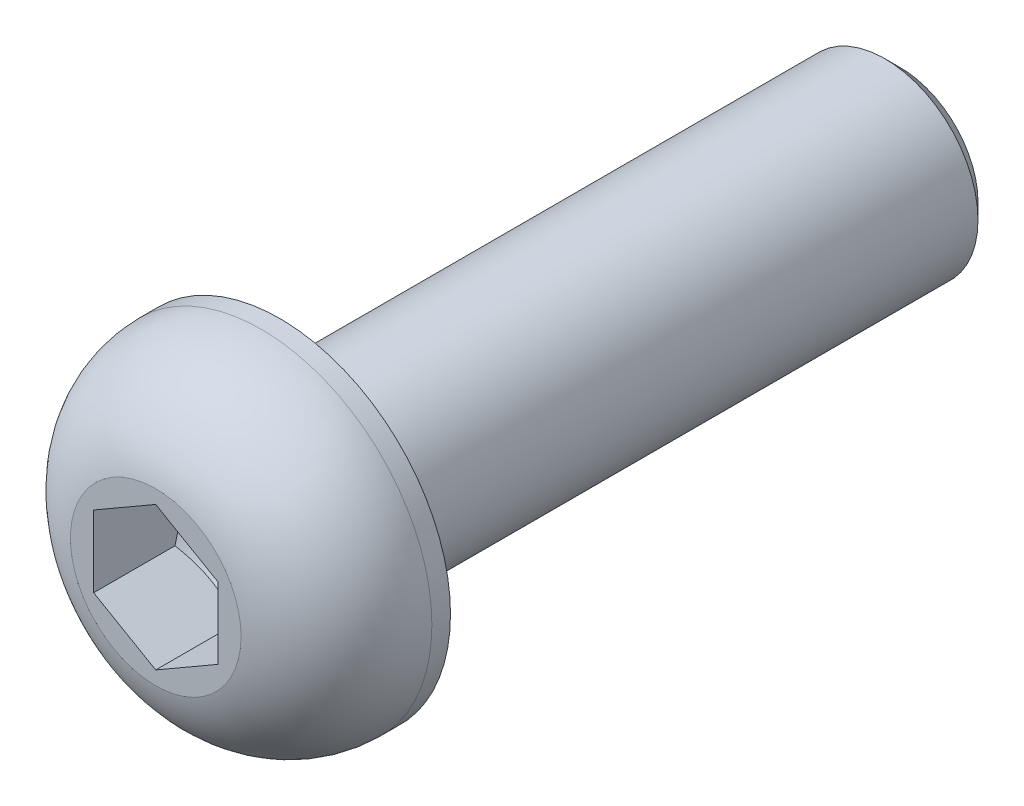
ISO-10303-21;
HEADER;
FILE_DESCRIPTION(('STEP AP214'),'2;1');
FILE_NAME('part.step','',(''),(''),'','','');
FILE_SCHEMA(('AUTOMOTIVE_DESIGN { 1 0 10303 214 1 1 1 1 }'));
ENDSEC;
DATA;
#1=APPLICATION_CONTEXT('core data for automotive mechanical design processes');
#2=APPLICATION_PROTOCOL_DEFINITION('international standard','automotive_design',2000,#1);
#3=PRODUCT_CONTEXT('',#1,'mechanical');
#4=PRODUCT('Part','Part','',(#3));
#5=PRODUCT_RELATED_PRODUCT_CATEGORY('part','',(#4));
#6=PRODUCT_DEFINITION_FORMATION('','',#4);
#7=PRODUCT_DEFINITION_CONTEXT('part definition',#1,'design');
#8=PRODUCT_DEFINITION('design','',#6,#7);
#9=PRODUCT_DEFINITION_SHAPE('','',#8);
#10=(LENGTH_UNIT() NAMED_UNIT(*) SI_UNIT(.MILLI.,.METRE.));
#11=(NAMED_UNIT(*) PLANE_ANGLE_UNIT() SI_UNIT($,.RADIAN.));
#12=(NAMED_UNIT(*) SI_UNIT($,.STERADIAN.) SOLID_ANGLE_UNIT());
#13=UNCERTAINTY_MEASURE_WITH_UNIT(LENGTH_MEASURE(1.E-05),#10,'distance_accuracy_value','');
#14=(GEOMETRIC_REPRESENTATION_CONTEXT(3) GLOBAL_UNCERTAINTY_ASSIGNED_CONTEXT((#13)) GLOBAL_UNIT_ASSIGNED_CONTEXT((#10,
#11,#12)) REPRESENTATION_CONTEXT('',''));
#15=CARTESIAN_POINT('',(0.,0.,0.));
#16=DIRECTION('',(0.,0.,1.));
#17=DIRECTION('',(1.,0.,0.));
#18=AXIS2_PLACEMENT_3D('',#15,#16,#17);
#19=CARTESIAN_POINT('',(0.,1.375,2.));
#20=DIRECTION('',(0.,0.,-1.));
#21=DIRECTION('',(-1.,0.,0.));
#22=AXIS2_PLACEMENT_3D('',#19,#20,#21);
#23=PLANE('',#22);
#24=CARTESIAN_POINT('',(0.,0.,2.));
#25=DIRECTION('',(0.,0.,1.));
#26=DIRECTION('',(1.,0.,0.));
#27=AXIS2_PLACEMENT_3D('',#24,#25,#26);
#28=CIRCLE('',#27,1.375);
#29=CARTESIAN_POINT('',(1.375,0.,2.));
#30=VERTEX_POINT('',#29);
#31=EDGE_CURVE('E133',#30,#30,#28,.T.);
#32=ORIENTED_EDGE('',*,*,#31,.T.);
#33=EDGE_LOOP('',(#32));
#34=FACE_BOUND('',#33,.T.);
#35=DIRECTION('',(-0.866025403784438,-0.5,0.));
#36=VECTOR('',#35,1.);
#37=CARTESIAN_POINT('',(0.,1.15470053837925,2.));
#38=LINE('',#37,#36);
#39=CARTESIAN_POINT('',(0.,1.15470053837925,2.));
#40=VERTEX_POINT('',#39);
#41=CARTESIAN_POINT('',(-1.,0.577350269189624,2.));
#42=VERTEX_POINT('',#41);
#43=EDGE_CURVE('E86',#40,#42,#38,.T.);
#44=ORIENTED_EDGE('',*,*,#43,.F.);
#45=DIRECTION('',(-0.866025403784439,0.5,0.));
#46=VECTOR('',#45,1.);
#47=CARTESIAN_POINT('',(0.999999999999999,0.577350269189626,2.));
#48=LINE('',#47,#46);
#49=CARTESIAN_POINT('',(0.999999999999999,0.577350269189626,2.));
#50=VERTEX_POINT('',#49);
#51=EDGE_CURVE('E46',#50,#40,#48,.T.);
#52=ORIENTED_EDGE('',*,*,#51,.F.);
#53=DIRECTION('',(0.,1.,0.));
#54=VECTOR('',#53,1.);
#55=CARTESIAN_POINT('',(1.,-0.577350269189625,2.));
#56=LINE('',#55,#54);
#57=CARTESIAN_POINT('',(1.,-0.577350269189625,2.));
#58=VERTEX_POINT('',#57);
#59=EDGE_CURVE('E114',#58,#50,#56,.T.);
#60=ORIENTED_EDGE('',*,*,#59,.F.);
#61=DIRECTION('',(0.866025403784438,0.5,0.));
#62=VECTOR('',#61,1.);
#63=CARTESIAN_POINT('',(0.,-1.15470053837925,2.));
#64=LINE('',#63,#62);
#65=CARTESIAN_POINT('',(0.,-1.15470053837925,2.));
#66=VERTEX_POINT('',#65);
#67=EDGE_CURVE('E108',#66,#58,#64,.T.);
#68=ORIENTED_EDGE('',*,*,#67,.F.);
#69=DIRECTION('',(0.866025403784439,-0.5,0.));
#70=VECTOR('',#69,1.);
#71=CARTESIAN_POINT('',(-1.,-0.577350269189625,2.));
#72=LINE('',#71,#70);
#73=CARTESIAN_POINT('',(-1.,-0.577350269189625,2.));
#74=VERTEX_POINT('',#73);
#75=EDGE_CURVE('E106',#74,#66,#72,.T.);
#76=ORIENTED_EDGE('',*,*,#75,.F.);
#77=DIRECTION('',(0.,-1.,0.));
#78=VECTOR('',#77,1.);
#79=CARTESIAN_POINT('',(-1.,0.577350269189624,2.));
#80=LINE('',#79,#78);
#81=EDGE_CURVE('E94',#42,#74,#80,.T.);
#82=ORIENTED_EDGE('',*,*,#81,.F.);
#83=EDGE_LOOP('',(#44,#52,#60,#68,#76,#82));
#84=FACE_BOUND('',#83,.T.);
#85=ADVANCED_FACE('F31',(#34,#84),#23,.F.);
#86=CARTESIAN_POINT('',(0.,0.,-10.));
#87=DIRECTION('',(0.,0.,1.));
#88=DIRECTION('',(1.,0.,0.));
#89=AXIS2_PLACEMENT_3D('',#86,#87,#88);
#90=PLANE('',#89);
#91=CARTESIAN_POINT('',(0.,0.,-10.));
#92=DIRECTION('',(0.,0.,1.));
#93=DIRECTION('',(1.,0.,0.));
#94=AXIS2_PLACEMENT_3D('',#91,#92,#93);
#95=CIRCLE('',#94,1.25);
#96=CARTESIAN_POINT('',(1.25,0.,-10.));
#97=VERTEX_POINT('',#96);
#98=EDGE_CURVE('E219',#97,#97,#95,.F.);
#99=ORIENTED_EDGE('',*,*,#98,.T.);
#100=EDGE_LOOP('',(#99));
#101=FACE_BOUND('',#100,.T.);
#102=ADVANCED_FACE('F197',(#101),#90,.F.);
#103=CARTESIAN_POINT('',(0.,0.,30.8099697885196));
#104=DIRECTION('',(0.,0.,1.));
#105=DIRECTION('',(1.,0.,0.));
#106=AXIS2_PLACEMENT_3D('',#103,#104,#105);
#107=CYLINDRICAL_SURFACE('',#106,1.5);
#108=CARTESIAN_POINT('',(0.,0.,-0.0999999999999994));
#109=DIRECTION('',(0.,0.,1.));
#110=DIRECTION('',(1.,0.,0.));
#111=AXIS2_PLACEMENT_3D('',#108,#109,#110);
#112=CIRCLE('',#111,1.5);
#113=CARTESIAN_POINT('',(1.5,0.,-0.0999999999999994));
#114=VERTEX_POINT('',#113);
#115=EDGE_CURVE('E11',#114,#114,#112,.F.);
#116=ORIENTED_EDGE('',*,*,#115,.T.);
#117=EDGE_LOOP('',(#116));
#118=FACE_BOUND('',#117,.T.);
#119=CARTESIAN_POINT('',(0.,0.,-9.75));
#120=DIRECTION('',(0.,0.,1.));
#121=DIRECTION('',(1.,0.,0.));
#122=AXIS2_PLACEMENT_3D('',#119,#120,#121);
#123=CIRCLE('',#122,1.5);
#124=CARTESIAN_POINT('',(1.5,0.,-9.75));
#125=VERTEX_POINT('',#124);
#126=EDGE_CURVE('E214',#125,#125,#123,.T.);
#127=ORIENTED_EDGE('',*,*,#126,.T.);
#128=EDGE_LOOP('',(#127));
#129=FACE_BOUND('',#128,.T.);
#130=ADVANCED_FACE('F202',(#118,#129),#107,.T.);
#131=CARTESIAN_POINT('',(0.,1.5,0.));
#132=DIRECTION('',(0.,0.,1.));
#133=DIRECTION('',(1.,0.,0.));
#134=AXIS2_PLACEMENT_3D('',#131,#132,#133);
#135=PLANE('',#134);
#136=CARTESIAN_POINT('',(0.,0.,0.));
#137=DIRECTION('',(0.,0.,1.));
#138=DIRECTION('',(1.,0.,0.));
#139=AXIS2_PLACEMENT_3D('',#136,#137,#138);
#140=CIRCLE('',#139,1.6);
#141=CARTESIAN_POINT('',(1.6,0.,0.));
#142=VERTEX_POINT('',#141);
#143=EDGE_CURVE('E39',#142,#142,#140,.T.);
#144=ORIENTED_EDGE('',*,*,#143,.T.);
#145=EDGE_LOOP('',(#144));
#146=FACE_BOUND('',#145,.T.);
#147=CARTESIAN_POINT('',(0.,0.,0.));
#148=DIRECTION('',(0.,0.,1.));
#149=DIRECTION('',(1.,0.,0.));
#150=AXIS2_PLACEMENT_3D('',#147,#148,#149);
#151=CIRCLE('',#150,2.75);
#152=CARTESIAN_POINT('',(2.75,0.,0.));
#153=VERTEX_POINT('',#152);
#154=EDGE_CURVE('E210',#153,#153,#151,.T.);
#155=ORIENTED_EDGE('',*,*,#154,.F.);
#156=EDGE_LOOP('',(#155));
#157=FACE_BOUND('',#156,.T.);
#158=ADVANCED_FACE('F224',(#146,#157),#135,.F.);
#159=CARTESIAN_POINT('',(0.,0.,30.8099697885196));
#160=DIRECTION('',(0.,0.,1.));
#161=DIRECTION('',(1.,0.,0.));
#162=AXIS2_PLACEMENT_3D('',#159,#160,#161);
#163=CYLINDRICAL_SURFACE('',#162,2.75);
#164=CARTESIAN_POINT('',(0.,0.,0.300000000000002));
#165=DIRECTION('',(0.,0.,1.));
#166=DIRECTION('',(1.,0.,0.));
#167=AXIS2_PLACEMENT_3D('',#164,#165,#166);
#168=CIRCLE('',#167,2.75);
#169=CARTESIAN_POINT('',(2.75,0.,0.300000000000002));
#170=VERTEX_POINT('',#169);
#171=EDGE_CURVE('E208',#170,#170,#168,.T.);
#172=ORIENTED_EDGE('',*,*,#171,.F.);
#173=EDGE_LOOP('',(#172));
#174=FACE_BOUND('',#173,.T.);
#175=ORIENTED_EDGE('',*,*,#154,.T.);
#176=EDGE_LOOP('',(#175));
#177=FACE_BOUND('',#176,.T.);
#178=ADVANCED_FACE('F246',(#174,#177),#163,.T.);
#179=CARTESIAN_POINT('',(0.,0.,0.3));
#180=DIRECTION('',(0.,0.,1.));
#181=DIRECTION('',(1.,0.,0.));
#182=AXIS2_PLACEMENT_3D('',#179,#180,#181);
#183=DEGENERATE_TOROIDAL_SURFACE('',#182,1.01159090909091,1.73840909090909,.T.);
#184=ORIENTED_EDGE('',*,*,#31,.F.);
#185=EDGE_LOOP('',(#184));
#186=FACE_BOUND('',#185,.T.);
#187=ORIENTED_EDGE('',*,*,#171,.T.);
#188=EDGE_LOOP('',(#187));
#189=FACE_BOUND('',#188,.T.);
#190=ADVANCED_FACE('F240',(#186,#189),#183,.T.);
#191=CARTESIAN_POINT('',(0.,0.,-9.75));
#192=DIRECTION('',(0.,0.,1.));
#193=DIRECTION('',(1.,0.,0.));
#194=AXIS2_PLACEMENT_3D('',#191,#192,#193);
#195=CONICAL_SURFACE('',#194,1.5,0.78539816339745);
#196=ORIENTED_EDGE('',*,*,#98,.F.);
#197=EDGE_LOOP('',(#196));
#198=FACE_BOUND('',#197,.T.);
#199=ORIENTED_EDGE('',*,*,#126,.F.);
#200=EDGE_LOOP('',(#199));
#201=FACE_BOUND('',#200,.T.);
#202=ADVANCED_FACE('F238',(#198,#201),#195,.T.);
#203=CARTESIAN_POINT('',(0.999999999999999,0.577350269189626,-10.001));
#204=DIRECTION('',(0.5,0.866025403784439,0.));
#205=DIRECTION('',(-0.866025403784439,0.5,0.));
#206=AXIS2_PLACEMENT_3D('',#203,#204,#205);
#207=PLANE('',#206);
#208=CARTESIAN_POINT('',(-0.000199999999999757,1.15481600843309,0.68938307414271));
#209=CARTESIAN_POINT('',(0.0437473193982804,1.12944301174833,0.67472537112619));
#210=CARTESIAN_POINT('',(0.0880739839498208,1.10385100003722,0.661394121097938));
#211=CARTESIAN_POINT('',(0.177495074671122,1.05222370923805,0.638122905100498));
#212=CARTESIAN_POINT('',(0.222591091201732,1.02618751195472,0.628191174026825));
#213=CARTESIAN_POINT('',(0.312224170522619,0.974437829480509,0.612729092359122));
#214=CARTESIAN_POINT('',(0.35674743223322,0.948732312346694,0.607095865575996));
#215=CARTESIAN_POINT('',(0.446003739715018,0.897200159195205,0.600367686117296));
#216=CARTESIAN_POINT('',(0.490736460481496,0.871373710819095,0.599267165398706));
#217=CARTESIAN_POINT('',(0.574341110817347,0.823104543442187,0.60154144977518));
#218=CARTESIAN_POINT('',(0.613225476788767,0.80065464428132,0.604357836340452));
#219=CARTESIAN_POINT('',(0.690740844985187,0.755901125586784,0.613288847694393));
#220=CARTESIAN_POINT('',(0.729371578561639,0.733597661157426,0.619406531231342));
#221=CARTESIAN_POINT('',(0.807047116484145,0.688751668428419,0.634702123202866));
#222=CARTESIAN_POINT('',(0.846082076271167,0.666214823887575,0.643944949646003));
#223=CARTESIAN_POINT('',(0.923569381276012,0.62147750748425,0.664923243232573));
#224=CARTESIAN_POINT('',(0.962022721293858,0.599276461273706,0.676653772610706));
#225=CARTESIAN_POINT('',(1.0002,0.577234799135788,0.68938307414271));
#226=B_SPLINE_CURVE_WITH_KNOTS('',3,(#208,#209,#210,#211,#212,#213,#214,#215,#216,#217,#218,
#219,#220,#221,#222,#223,#224,#225),.UNSPECIFIED.,.F.,.F.,(4,2,2,2,2,2,2,2,4),(0.,
0.158523820030116,0.317428970089343,0.472400167924634,0.627180939971649,0.762016584872711,
0.896977373984233,1.03493410168667,1.17261952416172),.UNSPECIFIED.);
#227=CARTESIAN_POINT('',(0.,1.15470053837925,0.689316397477043));
#228=VERTEX_POINT('',#227);
#229=CARTESIAN_POINT('',(0.999999999999999,0.577350269189626,0.689316397477044));
#230=VERTEX_POINT('',#229);
#231=EDGE_CURVE('E134',#228,#230,#226,.T.);
#232=ORIENTED_EDGE('',*,*,#231,.T.);
#233=DIRECTION('',(0.,0.,1.));
#234=VECTOR('',#233,1.);
#235=CARTESIAN_POINT('',(0.999999999999999,0.577350269189626,-10.001));
#236=LINE('',#235,#234);
#237=EDGE_CURVE('E116',#230,#50,#236,.T.);
#238=ORIENTED_EDGE('',*,*,#237,.T.);
#239=ORIENTED_EDGE('',*,*,#51,.T.);
#240=DIRECTION('',(0.,0.,1.));
#241=VECTOR('',#240,1.);
#242=CARTESIAN_POINT('',(0.,1.15470053837925,-10.001));
#243=LINE('',#242,#241);
#244=EDGE_CURVE('E91',#228,#40,#243,.T.);
#245=ORIENTED_EDGE('',*,*,#244,.F.);
#246=EDGE_LOOP('',(#232,#238,#239,#245));
#247=FACE_BOUND('',#246,.T.);
#248=ADVANCED_FACE('F144',(#247),#207,.F.);
#249=CARTESIAN_POINT('',(1.,-0.577350269189625,-10.001));
#250=DIRECTION('',(1.,0.,0.));
#251=DIRECTION('',(0.,1.,0.));
#252=AXIS2_PLACEMENT_3D('',#249,#250,#251);
#253=PLANE('',#252);
#254=CARTESIAN_POINT('',(1.,-1.56461625528364,1.09472311547174));
#255=CARTESIAN_POINT('',(1.,-1.52079499734677,1.07340863056256));
#256=CARTESIAN_POINT('',(1.,-1.47687498421635,1.05229812070288));
#257=CARTESIAN_POINT('',(1.,-1.38878384730274,1.01059070590997));
#258=CARTESIAN_POINT('',(1.,-1.34461268635773,0.98999387954938));
#259=CARTESIAN_POINT('',(1.,-1.21119982144206,0.928930533668274));
#260=CARTESIAN_POINT('',(1.,-1.12151489984587,0.889415813924549));
#261=CARTESIAN_POINT('',(1.,-0.937576713530856,0.813175874508064));
#262=CARTESIAN_POINT('',(1.,-0.843269086998662,0.776580326515081));
#263=CARTESIAN_POINT('',(1.,-0.652272334384316,0.710551775503785));
#264=CARTESIAN_POINT('',(1.,-0.55558910175336,0.681102698372737));
#265=CARTESIAN_POINT('',(1.,-0.408661232850146,0.645827460264465));
#266=CARTESIAN_POINT('',(1.,-0.359495053837031,0.635566946083281));
#267=CARTESIAN_POINT('',(1.,-0.260536197502252,0.618649214018791));
#268=CARTESIAN_POINT('',(0.999999999999999,-0.210743593690912,0.611991577303677));
#269=CARTESIAN_POINT('',(0.999999999999999,-0.111434663726945,0.602894456290144));
#270=CARTESIAN_POINT('',(0.999999999999999,-0.0619235309104458,0.600399817509567));
#271=CARTESIAN_POINT('',(0.999999999999999,0.0371303773373436,0.599688903403632));
#272=CARTESIAN_POINT('',(0.999999999999999,0.0866731541769791,0.601472834014163));
#273=CARTESIAN_POINT('',(0.999999999999999,0.204624350946089,0.610659971318302));
#274=CARTESIAN_POINT('',(0.999999999999999,0.272884420114126,0.619977024961572));
#275=CARTESIAN_POINT('',(0.999999999999999,0.408206929769774,0.645142826472754));
#276=CARTESIAN_POINT('',(0.999999999999999,0.475267983539709,0.660998683797673));
#277=CARTESIAN_POINT('',(0.999999999999999,0.575668987392459,0.688608289939156));
#278=CARTESIAN_POINT('',(0.999999999999999,0.609515152607504,0.698595243171584));
#279=CARTESIAN_POINT('',(0.999999999999999,0.676856430852944,0.719627116389914));
#280=CARTESIAN_POINT('',(0.999999999999999,0.710351738920768,0.730671409735581));
#281=CARTESIAN_POINT('',(0.999999999999999,0.777033339887853,0.753645581755856));
#282=CARTESIAN_POINT('',(0.999999999999999,0.810219645842316,0.765575422823643));
#283=CARTESIAN_POINT('',(0.999999999999999,0.876319770511067,0.790178187160949));
#284=CARTESIAN_POINT('',(0.999999999999999,0.909233551297761,0.802851211940421));
#285=CARTESIAN_POINT('',(0.999999999999999,1.01934169805935,0.846436222995127));
#286=CARTESIAN_POINT('',(0.999999999999999,1.09598118747863,0.878749348370683));
#287=CARTESIAN_POINT('',(0.999999999999999,1.24826893926839,0.945642453097312));
#288=CARTESIAN_POINT('',(0.999999999999999,1.32391697167074,0.980222947576953));
#289=CARTESIAN_POINT('',(0.999999999999999,1.47451993616702,1.05096415163354));
#290=CARTESIAN_POINT('',(0.999999999999999,1.54947445242947,1.08712574315354));
#291=CARTESIAN_POINT('',(0.999999999999999,1.69883785981991,1.16056127735209));
#292=CARTESIAN_POINT('',(0.999999999999999,1.7732467274398,1.19783526760929));
#293=CARTESIAN_POINT('',(0.999999999999999,1.99621082001519,1.31103166071074));
#294=CARTESIAN_POINT('',(0.999999999999999,2.14415263874811,1.38815975370858));
#295=CARTESIAN_POINT('',(0.999999999999999,2.43901274776553,1.54420308959703));
#296=CARTESIAN_POINT('',(0.999999999999998,2.58593139478534,1.62311766414626));
#297=CARTESIAN_POINT('',(0.999999999999998,2.85769653623644,1.77046631950725));
#298=CARTESIAN_POINT('',(0.999999999999998,2.98262757635445,1.83874462800004));
#299=CARTESIAN_POINT('',(0.999999999999998,3.23217965834939,1.97589734768577));
#300=CARTESIAN_POINT('',(0.999999999999998,3.35680066410952,2.04477182449327));
#301=CARTESIAN_POINT('',(0.999999999999998,3.60527049804183,2.18264970140429));
#302=CARTESIAN_POINT('',(0.999999999999998,3.72912034192021,2.25165127264977));
#303=CARTESIAN_POINT('',(0.999999999999998,3.97662428827573,2.38996919233029));
#304=CARTESIAN_POINT('',(0.999999999999998,4.10027841286108,2.45928550119292));
#305=CARTESIAN_POINT('',(0.999999999999998,4.22386926622729,2.52871381473293));
#306=B_SPLINE_CURVE_WITH_KNOTS('',3,(#254,#255,#256,#257,#258,#259,#260,#261,#262,#263,#264,
#265,#266,#267,#268,#269,#270,#271,#272,#273,#274,#275,#276,#277,#278,#279,#280,#281,#282,#283,
#284,#285,#286,#287,#288,#289,#290,#291,#292,#293,#294,#295,#296,#297,#298,#299,#300,#301,#302,
#303,#304,#305),.UNSPECIFIED.,.F.,.F.,(4,2,2,2,2,2,2,2,2,2,2,2,2,2,2,2,2,2,2,2,2,2,2,2,2,4),(0.,
0.146187831920744,0.292397889155072,0.586343089145063,0.889691473641029,1.19235109649664,
1.34291989510469,1.49347118644059,1.64201154906353,1.79055906136725,1.99681766302277,
2.2033011175938,2.30915425790313,2.41494504743426,2.52073134688346,2.62653212927526,
2.87598574887021,3.12549624008317,3.3751477307062,3.62480991457381,4.12530205258155,
4.62560994834962,5.05272258223352,5.47988283767622,5.90520571256295,6.33047651520575),.UNSPECIFIED.);
#307=CARTESIAN_POINT('',(1.,-0.577350269189625,0.689316397477044));
#308=VERTEX_POINT('',#307);
#309=EDGE_CURVE('E170',#230,#308,#306,.F.);
#310=ORIENTED_EDGE('',*,*,#309,.T.);
#311=DIRECTION('',(0.,0.,1.));
#312=VECTOR('',#311,1.);
#313=CARTESIAN_POINT('',(1.,-0.577350269189625,-10.001));
#314=LINE('',#313,#312);
#315=EDGE_CURVE('E118',#308,#58,#314,.T.);
#316=ORIENTED_EDGE('',*,*,#315,.T.);
#317=ORIENTED_EDGE('',*,*,#59,.T.);
#318=ORIENTED_EDGE('',*,*,#237,.F.);
#319=EDGE_LOOP('',(#310,#316,#317,#318));
#320=FACE_BOUND('',#319,.T.);
#321=ADVANCED_FACE('F179',(#320),#253,.F.);
#322=CARTESIAN_POINT('',(0.,-1.15470053837925,-10.001));
#323=DIRECTION('',(0.5,-0.866025403784438,0.));
#324=DIRECTION('',(0.866025403784439,0.5,0.));
#325=AXIS2_PLACEMENT_3D('',#322,#323,#324);
#326=PLANE('',#325);
#327=CARTESIAN_POINT('',(1.0002,-0.577234799135788,0.68938307414271));
#328=CARTESIAN_POINT('',(0.95625268060172,-0.602607795820547,0.67472537112619));
#329=CARTESIAN_POINT('',(0.911926016050179,-0.628199807531657,0.661394121097938));
#330=CARTESIAN_POINT('',(0.822504925328877,-0.679827098330831,0.638122905100498));
#331=CARTESIAN_POINT('',(0.777408908798268,-0.705863295614158,0.628191174026824));
#332=CARTESIAN_POINT('',(0.68777582947738,-0.757612978088367,0.612729092359121));
#333=CARTESIAN_POINT('',(0.64325256776678,-0.783318495222183,0.607095865575996));
#334=CARTESIAN_POINT('',(0.553996260284982,-0.834850648373671,0.600367686117296));
#335=CARTESIAN_POINT('',(0.509263539518504,-0.860677096749781,0.599267165398706));
#336=CARTESIAN_POINT('',(0.425658889182652,-0.90894626412669,0.60154144977518));
#337=CARTESIAN_POINT('',(0.386774523211233,-0.931396163287557,0.604357836340452));
#338=CARTESIAN_POINT('',(0.309259155014813,-0.976149681982093,0.613288847694393));
#339=CARTESIAN_POINT('',(0.27062842143836,-0.99845314641145,0.619406531231342));
#340=CARTESIAN_POINT('',(0.192952883515855,-1.04329913914046,0.634702123202866));
#341=CARTESIAN_POINT('',(0.153917923728832,-1.0658359836813,0.643944949646003));
#342=CARTESIAN_POINT('',(0.0764306187239883,-1.11057330008463,0.664923243232573));
#343=CARTESIAN_POINT('',(0.0379772787061414,-1.13277434629517,0.676653772610706));
#344=CARTESIAN_POINT('',(-0.000199999999999049,-1.15481600843309,0.68938307414271));
#345=B_SPLINE_CURVE_WITH_KNOTS('',3,(#327,#328,#329,#330,#331,#332,#333,#334,#335,#336,#337,
#338,#339,#340,#341,#342,#343,#344),.UNSPECIFIED.,.F.,.F.,(4,2,2,2,2,2,2,2,4),(0.,
0.158523820030116,0.317428970089343,0.472400167924634,0.627180939971649,0.762016584872712,
0.896977373984233,1.03493410168667,1.17261952416172),.UNSPECIFIED.);
#346=CARTESIAN_POINT('',(0.,-1.15470053837925,0.689316397477044));
#347=VERTEX_POINT('',#346);
#348=EDGE_CURVE('E164',#308,#347,#345,.T.);
#349=ORIENTED_EDGE('',*,*,#348,.T.);
#350=DIRECTION('',(0.,0.,1.));
#351=VECTOR('',#350,1.);
#352=CARTESIAN_POINT('',(0.,-1.15470053837925,-10.001));
#353=LINE('',#352,#351);
#354=EDGE_CURVE('E121',#347,#66,#353,.T.);
#355=ORIENTED_EDGE('',*,*,#354,.T.);
#356=ORIENTED_EDGE('',*,*,#67,.T.);
#357=ORIENTED_EDGE('',*,*,#315,.F.);
#358=EDGE_LOOP('',(#349,#355,#356,#357));
#359=FACE_BOUND('',#358,.T.);
#360=ADVANCED_FACE('F182',(#359),#326,.F.);
#361=CARTESIAN_POINT('',(-1.,-0.577350269189625,-10.001));
#362=DIRECTION('',(-0.5,-0.866025403784439,0.));
#363=DIRECTION('',(0.866025403784439,-0.5,0.));
#364=AXIS2_PLACEMENT_3D('',#361,#362,#363);
#365=PLANE('',#364);
#366=CARTESIAN_POINT('',(0.000200000000000838,-1.15481600843309,0.68938307414271));
#367=CARTESIAN_POINT('',(-0.0437473193982792,-1.12944301174833,0.67472537112619));
#368=CARTESIAN_POINT('',(-0.0880739839498196,-1.10385100003722,0.661394121097938));
#369=CARTESIAN_POINT('',(-0.177495074671121,-1.05222370923805,0.638122905100498));
#370=CARTESIAN_POINT('',(-0.222591091201731,-1.02618751195472,0.628191174026824));
#371=CARTESIAN_POINT('',(-0.312224170522618,-0.974437829480509,0.612729092359121));
#372=CARTESIAN_POINT('',(-0.356747432233219,-0.948732312346694,0.607095865575995));
#373=CARTESIAN_POINT('',(-0.446003739715017,-0.897200159195206,0.600367686117296));
#374=CARTESIAN_POINT('',(-0.490736460481494,-0.871373710819096,0.599267165398706));
#375=CARTESIAN_POINT('',(-0.574341110817346,-0.823104543442187,0.60154144977518));
#376=CARTESIAN_POINT('',(-0.613225476788766,-0.80065464428132,0.604357836340451));
#377=CARTESIAN_POINT('',(-0.690740844985186,-0.755901125586784,0.613288847694393));
#378=CARTESIAN_POINT('',(-0.729371578561639,-0.733597661157426,0.619406531231342));
#379=CARTESIAN_POINT('',(-0.807047116484145,-0.688751668428418,0.634702123202865));
#380=CARTESIAN_POINT('',(-0.846082076271168,-0.666214823887574,0.643944949646003));
#381=CARTESIAN_POINT('',(-0.923569381276012,-0.621477507484249,0.664923243232573));
#382=CARTESIAN_POINT('',(-0.962022721293859,-0.599276461273705,0.676653772610706));
#383=CARTESIAN_POINT('',(-1.0002,-0.577234799135787,0.68938307414271));
#384=B_SPLINE_CURVE_WITH_KNOTS('',3,(#366,#367,#368,#369,#370,#371,#372,#373,#374,#375,#376,
#377,#378,#379,#380,#381,#382,#383),.UNSPECIFIED.,.F.,.F.,(4,2,2,2,2,2,2,2,4),(0.,
0.158523820030116,0.317428970089343,0.472400167924634,0.627180939971649,0.762016584872712,
0.896977373984234,1.03493410168667,1.17261952416172),.UNSPECIFIED.);
#385=CARTESIAN_POINT('',(-1.,-0.577350269189705,0.689316397476991));
#386=VERTEX_POINT('',#385);
#387=EDGE_CURVE('E158',#347,#386,#384,.T.);
#388=ORIENTED_EDGE('',*,*,#387,.T.);
#389=DIRECTION('',(0.,0.,1.));
#390=VECTOR('',#389,1.);
#391=CARTESIAN_POINT('',(-1.,-0.577350269189625,-10.001));
#392=LINE('',#391,#390);
#393=EDGE_CURVE('E102',#386,#74,#392,.T.);
#394=ORIENTED_EDGE('',*,*,#393,.T.);
#395=ORIENTED_EDGE('',*,*,#75,.T.);
#396=ORIENTED_EDGE('',*,*,#354,.F.);
#397=EDGE_LOOP('',(#388,#394,#395,#396));
#398=FACE_BOUND('',#397,.T.);
#399=ADVANCED_FACE('F186',(#398),#365,.F.);
#400=CARTESIAN_POINT('',(-1.,0.577350269189624,-10.001));
#401=DIRECTION('',(-1.,0.,0.));
#402=DIRECTION('',(0.,0.,1.));
#403=AXIS2_PLACEMENT_3D('',#400,#401,#402);
#404=PLANE('',#403);
#405=CARTESIAN_POINT('',(-1.,-1.5646162549691,1.09472311531873));
#406=CARTESIAN_POINT('',(-1.,-1.52079499704286,1.07340863041596));
#407=CARTESIAN_POINT('',(-1.,-1.47687498392307,1.05229812056268));
#408=CARTESIAN_POINT('',(-1.,-1.38878384703077,1.01059070578255));
#409=CARTESIAN_POINT('',(-1.,-1.34461268609642,0.989993879428336));
#410=CARTESIAN_POINT('',(-1.,-1.21119982121305,0.928930533566389));
#411=CARTESIAN_POINT('',(-1.,-1.12151489963857,0.889415813835364));
#412=CARTESIAN_POINT('',(-1.,-0.937576713368663,0.813175874444226));
#413=CARTESIAN_POINT('',(-1.,-0.843269086859891,0.776580326463844));
#414=CARTESIAN_POINT('',(-1.,-0.652272334293365,0.710551775475596));
#415=CARTESIAN_POINT('',(-1.,-0.555589101686804,0.681102698355003));
#416=CARTESIAN_POINT('',(-1.,-0.408661232827391,0.64582746025987));
#417=CARTESIAN_POINT('',(-1.,-0.359495053833186,0.635566946083005));
#418=CARTESIAN_POINT('',(-1.,-0.26053619753668,0.618649214024295));
#419=CARTESIAN_POINT('',(-1.,-0.210743593744705,0.611991577310643));
#420=CARTESIAN_POINT('',(-1.,-0.111434663819163,0.602894456296586));
#421=CARTESIAN_POINT('',(-1.,-0.0619235310217198,0.600399817514085));
#422=CARTESIAN_POINT('',(-1.,0.0371303771882503,0.599688903400978));
#423=CARTESIAN_POINT('',(-1.,0.0866731540091226,0.60147283400626));
#424=CARTESIAN_POINT('',(-1.,0.204624350749565,0.61065997129584));
#425=CARTESIAN_POINT('',(-1.,0.272884419907872,0.619977024930328));
#426=CARTESIAN_POINT('',(-1.,0.408206929544783,0.645142826423737));
#427=CARTESIAN_POINT('',(-1.,0.475267983305713,0.660998683739662));
#428=CARTESIAN_POINT('',(-1.,0.575668987144925,0.688608289867846));
#429=CARTESIAN_POINT('',(-1.,0.60951515235532,0.698595243095792));
#430=CARTESIAN_POINT('',(-1.,0.676856430591517,0.719627116305296));
#431=CARTESIAN_POINT('',(-1.,0.710351738654749,0.730671409646619));
#432=CARTESIAN_POINT('',(-1.,0.77703333961268,0.753645581658358));
#433=CARTESIAN_POINT('',(-1.,0.810219645562582,0.765575422721952));
#434=CARTESIAN_POINT('',(-1.,0.876319770222208,0.790178187051015));
#435=CARTESIAN_POINT('',(-1.,0.90923355100434,0.802851211826436));
#436=CARTESIAN_POINT('',(-1.,1.01934169773806,0.846436222862805));
#437=CARTESIAN_POINT('',(-1.,1.09598118713422,0.878749348223829));
#438=CARTESIAN_POINT('',(-1.,1.24826893887788,0.945642452921374));
#439=CARTESIAN_POINT('',(-1.,1.32391697125725,0.980222947386462));
#440=CARTESIAN_POINT('',(-1.,1.47451993570763,1.05096415141403));
#441=CARTESIAN_POINT('',(-1.,1.54947445194715,1.08712574291956));
#442=CARTESIAN_POINT('',(-1.,1.69883785929173,1.16056127708928));
#443=CARTESIAN_POINT('',(-1.,1.77324672688868,1.19783526733212));
#444=CARTESIAN_POINT('',(-1.,1.99621081939529,1.31103166039068));
#445=CARTESIAN_POINT('',(-1.,2.14415263808233,1.38815975336015));
#446=CARTESIAN_POINT('',(-1.,2.43901274700784,1.54420308919221));
#447=CARTESIAN_POINT('',(-1.,2.58593139398161,1.62311766371341));
#448=CARTESIAN_POINT('',(-1.,2.85769653535063,1.77046631902449));
#449=CARTESIAN_POINT('',(-1.,2.98262757543261,1.83874462749538));
#450=CARTESIAN_POINT('',(-1.,3.23217965735538,1.97589734713749));
#451=CARTESIAN_POINT('',(-1.,3.3568006630794,2.04477182392326));
#452=CARTESIAN_POINT('',(-1.,3.60527049693922,2.18264970079083));
#453=CARTESIAN_POINT('',(-1.,3.72912034078124,2.2516512720146));
#454=CARTESIAN_POINT('',(-1.,3.976624287064,2.3899691916518));
#455=CARTESIAN_POINT('',(-1.,4.10027841161294,2.45928550049281));
#456=CARTESIAN_POINT('',(-1.,4.22386926494272,2.52871381401124));
#457=B_SPLINE_CURVE_WITH_KNOTS('',3,(#405,#406,#407,#408,#409,#410,#411,#412,#413,#414,#415,
#416,#417,#418,#419,#420,#421,#422,#423,#424,#425,#426,#427,#428,#429,#430,#431,#432,#433,#434,
#435,#436,#437,#438,#439,#440,#441,#442,#443,#444,#445,#446,#447,#448,#449,#450,#451,#452,#453,
#454,#455,#456),.UNSPECIFIED.,.F.,.F.,(4,2,2,2,2,2,2,2,2,2,2,2,2,2,2,2,2,2,2,2,2,2,2,2,2,4),(0.,
0.146187831883667,0.292397889080912,0.586343088995951,0.889691473412743,1.19235109618949,
1.34291989473949,1.49347118601743,1.64201154858377,1.79055906083088,1.99681766245395,
2.20330111699242,2.30915425728457,2.41494504679852,2.52073134623058,2.62653212860524,
2.87598574811934,3.12549623925145,3.37514772979366,3.62480991358046,4.12530205142678,
4.6256099470334,5.05272258079092,5.47988283610724,5.90520571086699,6.33047651338279),.UNSPECIFIED.);
#458=CARTESIAN_POINT('',(-1.,0.577350269189624,0.689316397477044));
#459=VERTEX_POINT('',#458);
#460=EDGE_CURVE('E101',#386,#459,#457,.T.);
#461=ORIENTED_EDGE('',*,*,#460,.T.);
#462=DIRECTION('',(0.,0.,1.));
#463=VECTOR('',#462,1.);
#464=CARTESIAN_POINT('',(-1.,0.577350269189624,-10.001));
#465=LINE('',#464,#463);
#466=EDGE_CURVE('E90',#459,#42,#465,.T.);
#467=ORIENTED_EDGE('',*,*,#466,.T.);
#468=ORIENTED_EDGE('',*,*,#81,.T.);
#469=ORIENTED_EDGE('',*,*,#393,.F.);
#470=EDGE_LOOP('',(#461,#467,#468,#469));
#471=FACE_BOUND('',#470,.T.);
#472=ADVANCED_FACE('F98',(#471),#404,.F.);
#473=CARTESIAN_POINT('',(0.,1.15470053837925,-10.001));
#474=DIRECTION('',(-0.5,0.866025403784438,0.));
#475=DIRECTION('',(-0.866025403784438,-0.5,0.));
#476=AXIS2_PLACEMENT_3D('',#473,#474,#475);
#477=PLANE('',#476);
#478=CARTESIAN_POINT('',(-1.0002,0.577234799135786,0.68938307414271));
#479=CARTESIAN_POINT('',(-0.95625268060172,0.602607795820546,0.67472537112619));
#480=CARTESIAN_POINT('',(-0.91192601605018,0.628199807531656,0.661394121097938));
#481=CARTESIAN_POINT('',(-0.822504925328878,0.67982709833083,0.638122905100498));
#482=CARTESIAN_POINT('',(-0.777408908798268,0.705863295614157,0.628191174026824));
#483=CARTESIAN_POINT('',(-0.687775829477381,0.757612978088366,0.612729092359121));
#484=CARTESIAN_POINT('',(-0.64325256776678,0.783318495222182,0.607095865575995));
#485=CARTESIAN_POINT('',(-0.553996260284982,0.83485064837367,0.600367686117296));
#486=CARTESIAN_POINT('',(-0.509263539518505,0.86067709674978,0.599267165398706));
#487=CARTESIAN_POINT('',(-0.425658889182653,0.908946264126689,0.60154144977518));
#488=CARTESIAN_POINT('',(-0.386774523211233,0.931396163287556,0.604357836340451));
#489=CARTESIAN_POINT('',(-0.309259155014813,0.976149681982092,0.613288847694392));
#490=CARTESIAN_POINT('',(-0.27062842143836,0.99845314641145,0.619406531231342));
#491=CARTESIAN_POINT('',(-0.192952883515855,1.04329913914046,0.634702123202865));
#492=CARTESIAN_POINT('',(-0.153917923728832,1.0658359836813,0.643944949646003));
#493=CARTESIAN_POINT('',(-0.0764306187239877,1.11057330008463,0.664923243232573));
#494=CARTESIAN_POINT('',(-0.0379772787061405,1.13277434629517,0.676653772610706));
#495=CARTESIAN_POINT('',(0.000200000000000121,1.15481600843309,0.68938307414271));
#496=B_SPLINE_CURVE_WITH_KNOTS('',3,(#478,#479,#480,#481,#482,#483,#484,#485,#486,#487,#488,
#489,#490,#491,#492,#493,#494,#495),.UNSPECIFIED.,.F.,.F.,(4,2,2,2,2,2,2,2,4),(0.,
0.158523820030116,0.317428970089343,0.472400167924634,0.627180939971649,0.762016584872712,
0.896977373984234,1.03493410168667,1.17261952416172),.UNSPECIFIED.);
#497=EDGE_CURVE('E126',#459,#228,#496,.T.);
#498=ORIENTED_EDGE('',*,*,#497,.T.);
#499=ORIENTED_EDGE('',*,*,#244,.T.);
#500=ORIENTED_EDGE('',*,*,#43,.T.);
#501=ORIENTED_EDGE('',*,*,#466,.F.);
#502=EDGE_LOOP('',(#498,#499,#500,#501));
#503=FACE_BOUND('',#502,.T.);
#504=ADVANCED_FACE('F89',(#503),#477,.F.);
#505=CARTESIAN_POINT('',(0.,0.,0.0226497308103693));
#506=DIRECTION('',(0.,0.,1.));
#507=DIRECTION('',(1.,0.,0.));
#508=AXIS2_PLACEMENT_3D('',#505,#506,#507);
#509=CONICAL_SURFACE('',#508,0.,1.04719755119659);
#510=ORIENTED_EDGE('',*,*,#348,.F.);
#511=ORIENTED_EDGE('',*,*,#309,.F.);
#512=ORIENTED_EDGE('',*,*,#231,.F.);
#513=ORIENTED_EDGE('',*,*,#497,.F.);
#514=ORIENTED_EDGE('',*,*,#460,.F.);
#515=ORIENTED_EDGE('',*,*,#387,.F.);
#516=EDGE_LOOP('',(#510,#511,#512,#513,#514,#515));
#517=FACE_BOUND('',#516,.T.);
#518=CARTESIAN_POINT('',(0.,0.,0.0226497308103694));
#519=VERTEX_POINT('',#518);
#520=VERTEX_LOOP('',#519);
#521=FACE_BOUND('',#520,.T.);
#522=ADVANCED_FACE('F139',(#517,#521),#509,.F.);
#523=CARTESIAN_POINT('',(0.,0.,-0.0999999999999994));
#524=DIRECTION('',(0.,0.,1.));
#525=DIRECTION('',(1.,0.,0.));
#526=AXIS2_PLACEMENT_3D('',#523,#524,#525);
#527=TOROIDAL_SURFACE('',#526,1.6,0.1);
#528=ORIENTED_EDGE('',*,*,#115,.F.);
#529=EDGE_LOOP('',(#528));
#530=FACE_BOUND('',#529,.T.);
#531=ORIENTED_EDGE('',*,*,#143,.F.);
#532=EDGE_LOOP('',(#531));
#533=FACE_BOUND('',#532,.T.);
#534=ADVANCED_FACE('F33',(#530,#533),#527,.F.);
#535=CLOSED_SHELL('',(#85,#102,#130,#158,#178,#190,#202,#248,#321,#360,#399,#472,#504,#522,#534));
#536=MANIFOLD_SOLID_BREP('B2',#535);
#537=ADVANCED_BREP_SHAPE_REPRESENTATION('',(#18,#536),#14);
#538=SHAPE_DEFINITION_REPRESENTATION(#9,#537);
ENDSEC;
END-ISO-10303-21;
